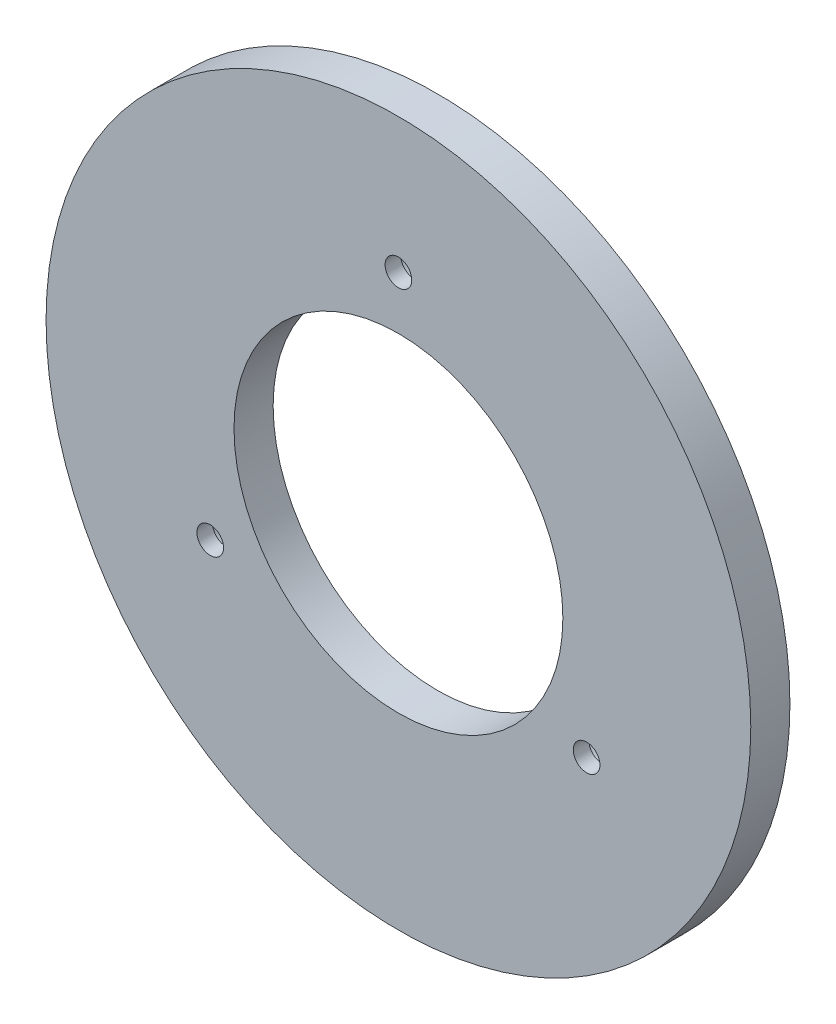
ISO-10303-21;
HEADER;
FILE_DESCRIPTION(('STEP AP214'),'2;1');
FILE_NAME('part.step','',(''),(''),'','','');
FILE_SCHEMA(('AUTOMOTIVE_DESIGN { 1 0 10303 214 1 1 1 1 }'));
ENDSEC;
DATA;
#1=APPLICATION_CONTEXT('core data for automotive mechanical design processes');
#2=APPLICATION_PROTOCOL_DEFINITION('international standard','automotive_design',2000,#1);
#3=PRODUCT_CONTEXT('',#1,'mechanical');
#4=PRODUCT('Part','Part','',(#3));
#5=PRODUCT_RELATED_PRODUCT_CATEGORY('part','',(#4));
#6=PRODUCT_DEFINITION_FORMATION('','',#4);
#7=PRODUCT_DEFINITION_CONTEXT('part definition',#1,'design');
#8=PRODUCT_DEFINITION('design','',#6,#7);
#9=PRODUCT_DEFINITION_SHAPE('','',#8);
#10=(LENGTH_UNIT() NAMED_UNIT(*) SI_UNIT(.MILLI.,.METRE.));
#11=(NAMED_UNIT(*) PLANE_ANGLE_UNIT() SI_UNIT($,.RADIAN.));
#12=(NAMED_UNIT(*) SI_UNIT($,.STERADIAN.) SOLID_ANGLE_UNIT());
#13=UNCERTAINTY_MEASURE_WITH_UNIT(LENGTH_MEASURE(1.E-05),#10,'distance_accuracy_value','');
#14=(GEOMETRIC_REPRESENTATION_CONTEXT(3) GLOBAL_UNCERTAINTY_ASSIGNED_CONTEXT((#13)) GLOBAL_UNIT_ASSIGNED_CONTEXT((#10,
#11,#12)) REPRESENTATION_CONTEXT('',''));
#15=CARTESIAN_POINT('',(0.,0.,0.));
#16=DIRECTION('',(0.,0.,1.));
#17=DIRECTION('',(1.,0.,0.));
#18=AXIS2_PLACEMENT_3D('',#15,#16,#17);
#19=CARTESIAN_POINT('',(24.0322049550165,-13.875000000001,0.));
#20=DIRECTION('',(0.,0.,-1.));
#21=DIRECTION('',(-1.,0.,0.));
#22=AXIS2_PLACEMENT_3D('',#19,#20,#21);
#23=CYLINDRICAL_SURFACE('',#22,1.69999999999999);
#24=CARTESIAN_POINT('',(24.0322049550165,-13.875000000001,5.));
#25=DIRECTION('',(0.,0.,1.));
#26=DIRECTION('',(1.,0.,0.));
#27=AXIS2_PLACEMENT_3D('',#24,#25,#26);
#28=CIRCLE('',#27,1.69999999999999);
#29=CARTESIAN_POINT('',(25.7322049550165,-13.875000000001,5.));
#30=VERTEX_POINT('',#29);
#31=EDGE_CURVE('E67',#30,#30,#28,.T.);
#32=ORIENTED_EDGE('',*,*,#31,.T.);
#33=EDGE_LOOP('',(#32));
#34=FACE_BOUND('',#33,.T.);
#35=CARTESIAN_POINT('',(24.0322049550165,-13.875000000001,3.));
#36=DIRECTION('',(0.,0.,-1.));
#37=DIRECTION('',(-1.,0.,0.));
#38=AXIS2_PLACEMENT_3D('',#35,#36,#37);
#39=CIRCLE('',#38,1.69999999999999);
#40=CARTESIAN_POINT('',(22.3322049550165,-13.875000000001,3.));
#41=VERTEX_POINT('',#40);
#42=EDGE_CURVE('E35',#41,#41,#39,.F.);
#43=ORIENTED_EDGE('',*,*,#42,.F.);
#44=EDGE_LOOP('',(#43));
#45=FACE_BOUND('',#44,.T.);
#46=ADVANCED_FACE('F31',(#34,#45),#23,.F.);
#47=CARTESIAN_POINT('',(-24.0322049550199,-13.874999999999,0.));
#48=DIRECTION('',(0.,0.,-1.));
#49=DIRECTION('',(-1.,0.,0.));
#50=AXIS2_PLACEMENT_3D('',#47,#48,#49);
#51=CYLINDRICAL_SURFACE('',#50,1.69999999999999);
#52=CARTESIAN_POINT('',(-24.0322049550199,-13.874999999999,5.));
#53=DIRECTION('',(0.,0.,1.));
#54=DIRECTION('',(1.,0.,0.));
#55=AXIS2_PLACEMENT_3D('',#52,#53,#54);
#56=CIRCLE('',#55,1.69999999999999);
#57=CARTESIAN_POINT('',(-22.3322049550199,-13.874999999999,5.));
#58=VERTEX_POINT('',#57);
#59=EDGE_CURVE('E62',#58,#58,#56,.T.);
#60=ORIENTED_EDGE('',*,*,#59,.T.);
#61=EDGE_LOOP('',(#60));
#62=FACE_BOUND('',#61,.T.);
#63=CARTESIAN_POINT('',(-24.0322049550199,-13.874999999999,3.));
#64=DIRECTION('',(0.,0.,-1.));
#65=DIRECTION('',(-1.,0.,0.));
#66=AXIS2_PLACEMENT_3D('',#63,#64,#65);
#67=CIRCLE('',#66,1.69999999999999);
#68=CARTESIAN_POINT('',(-25.7322049550199,-13.874999999999,3.));
#69=VERTEX_POINT('',#68);
#70=EDGE_CURVE('E52',#69,#69,#67,.F.);
#71=ORIENTED_EDGE('',*,*,#70,.F.);
#72=EDGE_LOOP('',(#71));
#73=FACE_BOUND('',#72,.T.);
#74=ADVANCED_FACE('F97',(#62,#73),#51,.F.);
#75=CARTESIAN_POINT('',(0.,27.75,0.));
#76=DIRECTION('',(0.,0.,-1.));
#77=DIRECTION('',(-1.,0.,0.));
#78=AXIS2_PLACEMENT_3D('',#75,#76,#77);
#79=CYLINDRICAL_SURFACE('',#78,1.69999999999999);
#80=CARTESIAN_POINT('',(0.,27.75,5.));
#81=DIRECTION('',(0.,0.,1.));
#82=DIRECTION('',(1.,0.,0.));
#83=AXIS2_PLACEMENT_3D('',#80,#81,#82);
#84=CIRCLE('',#83,1.69999999999999);
#85=CARTESIAN_POINT('',(1.69999999999999,27.75,5.));
#86=VERTEX_POINT('',#85);
#87=EDGE_CURVE('E58',#86,#86,#84,.T.);
#88=ORIENTED_EDGE('',*,*,#87,.T.);
#89=EDGE_LOOP('',(#88));
#90=FACE_BOUND('',#89,.T.);
#91=CARTESIAN_POINT('',(0.,27.75,3.));
#92=DIRECTION('',(0.,0.,-1.));
#93=DIRECTION('',(-1.,0.,0.));
#94=AXIS2_PLACEMENT_3D('',#91,#92,#93);
#95=CIRCLE('',#94,1.69999999999999);
#96=CARTESIAN_POINT('',(-1.69999999999999,27.75,3.));
#97=VERTEX_POINT('',#96);
#98=EDGE_CURVE('E50',#97,#97,#95,.F.);
#99=ORIENTED_EDGE('',*,*,#98,.F.);
#100=EDGE_LOOP('',(#99));
#101=FACE_BOUND('',#100,.T.);
#102=ADVANCED_FACE('F102',(#90,#101),#79,.F.);
#103=CARTESIAN_POINT('',(0.,0.,5.));
#104=DIRECTION('',(0.,0.,1.));
#105=DIRECTION('',(1.,0.,0.));
#106=AXIS2_PLACEMENT_3D('',#103,#104,#105);
#107=PLANE('',#106);
#108=ORIENTED_EDGE('',*,*,#87,.F.);
#109=EDGE_LOOP('',(#108));
#110=FACE_BOUND('',#109,.T.);
#111=ORIENTED_EDGE('',*,*,#59,.F.);
#112=EDGE_LOOP('',(#111));
#113=FACE_BOUND('',#112,.T.);
#114=ORIENTED_EDGE('',*,*,#31,.F.);
#115=EDGE_LOOP('',(#114));
#116=FACE_BOUND('',#115,.T.);
#117=CARTESIAN_POINT('',(0.,0.,5.));
#118=DIRECTION('',(0.,0.,1.));
#119=DIRECTION('',(1.,0.,0.));
#120=AXIS2_PLACEMENT_3D('',#117,#118,#119);
#121=CIRCLE('',#120,45.);
#122=CARTESIAN_POINT('',(45.,0.,5.));
#123=VERTEX_POINT('',#122);
#124=EDGE_CURVE('E10',#123,#123,#121,.T.);
#125=ORIENTED_EDGE('',*,*,#124,.T.);
#126=EDGE_LOOP('',(#125));
#127=FACE_BOUND('',#126,.T.);
#128=CARTESIAN_POINT('',(0.,0.,5.));
#129=DIRECTION('',(0.,0.,1.));
#130=DIRECTION('',(1.,0.,0.));
#131=AXIS2_PLACEMENT_3D('',#128,#129,#130);
#132=CIRCLE('',#131,21.);
#133=CARTESIAN_POINT('',(21.,0.,5.));
#134=VERTEX_POINT('',#133);
#135=EDGE_CURVE('E44',#134,#134,#132,.T.);
#136=ORIENTED_EDGE('',*,*,#135,.F.);
#137=EDGE_LOOP('',(#136));
#138=FACE_BOUND('',#137,.T.);
#139=ADVANCED_FACE('F109',(#110,#113,#116,#127,#138),#107,.T.);
#140=CARTESIAN_POINT('',(0.,0.,0.));
#141=DIRECTION('',(0.,0.,1.));
#142=DIRECTION('',(1.,0.,0.));
#143=AXIS2_PLACEMENT_3D('',#140,#141,#142);
#144=PLANE('',#143);
#145=CARTESIAN_POINT('',(0.,27.75,0.));
#146=DIRECTION('',(0.,0.,-1.));
#147=DIRECTION('',(-1.,0.,0.));
#148=AXIS2_PLACEMENT_3D('',#145,#146,#147);
#149=CIRCLE('',#148,3.2);
#150=CARTESIAN_POINT('',(-3.2,27.75,0.));
#151=VERTEX_POINT('',#150);
#152=EDGE_CURVE('E135',#151,#151,#149,.T.);
#153=ORIENTED_EDGE('',*,*,#152,.F.);
#154=EDGE_LOOP('',(#153));
#155=FACE_BOUND('',#154,.T.);
#156=CARTESIAN_POINT('',(-23.3826859021816,-13.499999999999,0.));
#157=DIRECTION('',(0.,0.,-1.));
#158=DIRECTION('',(-1.,0.,0.));
#159=AXIS2_PLACEMENT_3D('',#156,#157,#158);
#160=CIRCLE('',#159,3.20000000000148);
#161=CARTESIAN_POINT('',(-26.582685902183,-13.499999999999,0.));
#162=VERTEX_POINT('',#161);
#163=EDGE_CURVE('E141',#162,#162,#160,.T.);
#164=ORIENTED_EDGE('',*,*,#163,.F.);
#165=EDGE_LOOP('',(#164));
#166=FACE_BOUND('',#165,.T.);
#167=CARTESIAN_POINT('',(24.0322049550165,-13.125000000001,0.));
#168=DIRECTION('',(0.,0.,-1.));
#169=DIRECTION('',(-1.,0.,0.));
#170=AXIS2_PLACEMENT_3D('',#167,#168,#169);
#171=CIRCLE('',#170,3.2);
#172=CARTESIAN_POINT('',(20.8322049550165,-13.125000000001,0.));
#173=VERTEX_POINT('',#172);
#174=EDGE_CURVE('E70',#173,#173,#171,.T.);
#175=ORIENTED_EDGE('',*,*,#174,.F.);
#176=EDGE_LOOP('',(#175));
#177=FACE_BOUND('',#176,.T.);
#178=CARTESIAN_POINT('',(0.,0.,0.));
#179=DIRECTION('',(0.,0.,1.));
#180=DIRECTION('',(1.,0.,0.));
#181=AXIS2_PLACEMENT_3D('',#178,#179,#180);
#182=CIRCLE('',#181,45.);
#183=CARTESIAN_POINT('',(45.,0.,0.));
#184=VERTEX_POINT('',#183);
#185=EDGE_CURVE('E39',#184,#184,#182,.T.);
#186=ORIENTED_EDGE('',*,*,#185,.F.);
#187=EDGE_LOOP('',(#186));
#188=FACE_BOUND('',#187,.T.);
#189=CARTESIAN_POINT('',(0.,0.,0.));
#190=DIRECTION('',(0.,0.,1.));
#191=DIRECTION('',(1.,0.,0.));
#192=AXIS2_PLACEMENT_3D('',#189,#190,#191);
#193=CIRCLE('',#192,21.);
#194=CARTESIAN_POINT('',(21.,0.,0.));
#195=VERTEX_POINT('',#194);
#196=EDGE_CURVE('E47',#195,#195,#193,.T.);
#197=ORIENTED_EDGE('',*,*,#196,.T.);
#198=EDGE_LOOP('',(#197));
#199=FACE_BOUND('',#198,.T.);
#200=ADVANCED_FACE('F80',(#155,#166,#177,#188,#199),#144,.F.);
#201=CARTESIAN_POINT('',(0.,0.,5.));
#202=DIRECTION('',(0.,0.,-1.));
#203=DIRECTION('',(-1.,0.,0.));
#204=AXIS2_PLACEMENT_3D('',#201,#202,#203);
#205=CYLINDRICAL_SURFACE('',#204,45.);
#206=ORIENTED_EDGE('',*,*,#124,.F.);
#207=EDGE_LOOP('',(#206));
#208=FACE_BOUND('',#207,.T.);
#209=ORIENTED_EDGE('',*,*,#185,.T.);
#210=EDGE_LOOP('',(#209));
#211=FACE_BOUND('',#210,.T.);
#212=ADVANCED_FACE('F33',(#208,#211),#205,.T.);
#213=CARTESIAN_POINT('',(0.,0.,5.));
#214=DIRECTION('',(0.,0.,-1.));
#215=DIRECTION('',(-1.,0.,0.));
#216=AXIS2_PLACEMENT_3D('',#213,#214,#215);
#217=CYLINDRICAL_SURFACE('',#216,21.);
#218=ORIENTED_EDGE('',*,*,#135,.T.);
#219=EDGE_LOOP('',(#218));
#220=FACE_BOUND('',#219,.T.);
#221=ORIENTED_EDGE('',*,*,#196,.F.);
#222=EDGE_LOOP('',(#221));
#223=FACE_BOUND('',#222,.T.);
#224=ADVANCED_FACE('F82',(#220,#223),#217,.F.);
#225=CARTESIAN_POINT('',(0.,27.75,3.));
#226=DIRECTION('',(0.,0.,-1.));
#227=DIRECTION('',(-1.,0.,0.));
#228=AXIS2_PLACEMENT_3D('',#225,#226,#227);
#229=PLANE('',#228);
#230=CARTESIAN_POINT('',(0.,27.75,3.));
#231=DIRECTION('',(0.,0.,-1.));
#232=DIRECTION('',(-1.,0.,0.));
#233=AXIS2_PLACEMENT_3D('',#230,#231,#232);
#234=CIRCLE('',#233,3.2);
#235=CARTESIAN_POINT('',(-3.2,27.75,3.));
#236=VERTEX_POINT('',#235);
#237=EDGE_CURVE('E53',#236,#236,#234,.T.);
#238=ORIENTED_EDGE('',*,*,#237,.T.);
#239=EDGE_LOOP('',(#238));
#240=FACE_BOUND('',#239,.T.);
#241=ORIENTED_EDGE('',*,*,#98,.T.);
#242=EDGE_LOOP('',(#241));
#243=FACE_BOUND('',#242,.T.);
#244=ADVANCED_FACE('F84',(#240,#243),#229,.T.);
#245=CARTESIAN_POINT('',(0.,27.75,3.));
#246=DIRECTION('',(0.,0.,-1.));
#247=DIRECTION('',(-1.,0.,0.));
#248=AXIS2_PLACEMENT_3D('',#245,#246,#247);
#249=CYLINDRICAL_SURFACE('',#248,3.2);
#250=ORIENTED_EDGE('',*,*,#237,.F.);
#251=EDGE_LOOP('',(#250));
#252=FACE_BOUND('',#251,.T.);
#253=ORIENTED_EDGE('',*,*,#152,.T.);
#254=EDGE_LOOP('',(#253));
#255=FACE_BOUND('',#254,.T.);
#256=ADVANCED_FACE('F90',(#252,#255),#249,.F.);
#257=CARTESIAN_POINT('',(-23.3826859021816,-13.499999999999,3.));
#258=DIRECTION('',(0.,0.,-1.));
#259=DIRECTION('',(-1.,0.,0.));
#260=AXIS2_PLACEMENT_3D('',#257,#258,#259);
#261=PLANE('',#260);
#262=CARTESIAN_POINT('',(-23.3826859021816,-13.499999999999,3.));
#263=DIRECTION('',(0.,0.,-1.));
#264=DIRECTION('',(-1.,0.,0.));
#265=AXIS2_PLACEMENT_3D('',#262,#263,#264);
#266=CIRCLE('',#265,3.20000000000148);
#267=CARTESIAN_POINT('',(-26.582685902183,-13.499999999999,3.));
#268=VERTEX_POINT('',#267);
#269=EDGE_CURVE('E137',#268,#268,#266,.T.);
#270=ORIENTED_EDGE('',*,*,#269,.T.);
#271=EDGE_LOOP('',(#270));
#272=FACE_BOUND('',#271,.T.);
#273=ORIENTED_EDGE('',*,*,#70,.T.);
#274=EDGE_LOOP('',(#273));
#275=FACE_BOUND('',#274,.T.);
#276=ADVANCED_FACE('F121',(#272,#275),#261,.T.);
#277=CARTESIAN_POINT('',(-23.3826859021816,-13.499999999999,3.));
#278=DIRECTION('',(0.,0.,-1.));
#279=DIRECTION('',(-1.,0.,0.));
#280=AXIS2_PLACEMENT_3D('',#277,#278,#279);
#281=CYLINDRICAL_SURFACE('',#280,3.20000000000148);
#282=ORIENTED_EDGE('',*,*,#269,.F.);
#283=EDGE_LOOP('',(#282));
#284=FACE_BOUND('',#283,.T.);
#285=ORIENTED_EDGE('',*,*,#163,.T.);
#286=EDGE_LOOP('',(#285));
#287=FACE_BOUND('',#286,.T.);
#288=ADVANCED_FACE('F117',(#284,#287),#281,.F.);
#289=CARTESIAN_POINT('',(24.0322049550165,-13.125000000001,3.));
#290=DIRECTION('',(0.,0.,-1.));
#291=DIRECTION('',(-1.,0.,0.));
#292=AXIS2_PLACEMENT_3D('',#289,#290,#291);
#293=PLANE('',#292);
#294=CARTESIAN_POINT('',(24.0322049550165,-13.125000000001,3.));
#295=DIRECTION('',(0.,0.,-1.));
#296=DIRECTION('',(-1.,0.,0.));
#297=AXIS2_PLACEMENT_3D('',#294,#295,#296);
#298=CIRCLE('',#297,3.2);
#299=CARTESIAN_POINT('',(20.8322049550165,-13.125000000001,3.));
#300=VERTEX_POINT('',#299);
#301=EDGE_CURVE('E145',#300,#300,#298,.T.);
#302=ORIENTED_EDGE('',*,*,#301,.T.);
#303=EDGE_LOOP('',(#302));
#304=FACE_BOUND('',#303,.T.);
#305=ORIENTED_EDGE('',*,*,#42,.T.);
#306=EDGE_LOOP('',(#305));
#307=FACE_BOUND('',#306,.T.);
#308=ADVANCED_FACE('F113',(#304,#307),#293,.T.);
#309=CARTESIAN_POINT('',(24.0322049550165,-13.125000000001,3.));
#310=DIRECTION('',(0.,0.,-1.));
#311=DIRECTION('',(-1.,0.,0.));
#312=AXIS2_PLACEMENT_3D('',#309,#310,#311);
#313=CYLINDRICAL_SURFACE('',#312,3.2);
#314=ORIENTED_EDGE('',*,*,#301,.F.);
#315=EDGE_LOOP('',(#314));
#316=FACE_BOUND('',#315,.T.);
#317=ORIENTED_EDGE('',*,*,#174,.T.);
#318=EDGE_LOOP('',(#317));
#319=FACE_BOUND('',#318,.T.);
#320=ADVANCED_FACE('F110',(#316,#319),#313,.F.);
#321=CLOSED_SHELL('',(#46,#74,#102,#139,#200,#212,#224,#244,#256,#276,#288,#308,#320));
#322=MANIFOLD_SOLID_BREP('B2',#321);
#323=ADVANCED_BREP_SHAPE_REPRESENTATION('',(#18,#322),#14);
#324=SHAPE_DEFINITION_REPRESENTATION(#9,#323);
ENDSEC;
END-ISO-10303-21;
